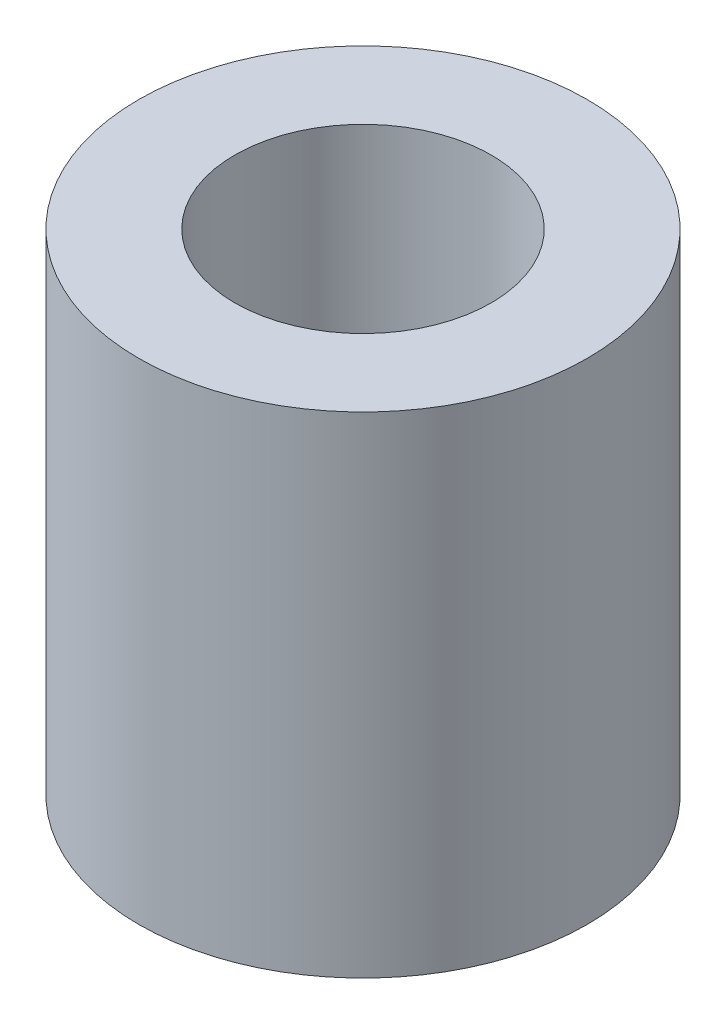
ISO-10303-21;
HEADER;
FILE_DESCRIPTION(('STEP AP214'),'2;1');
FILE_NAME('part.step','',(''),(''),'','','');
FILE_SCHEMA(('AUTOMOTIVE_DESIGN { 1 0 10303 214 1 1 1 1 }'));
ENDSEC;
DATA;
#1=APPLICATION_CONTEXT('core data for automotive mechanical design processes');
#2=APPLICATION_PROTOCOL_DEFINITION('international standard','automotive_design',2000,#1);
#3=PRODUCT_CONTEXT('',#1,'mechanical');
#4=PRODUCT('Part','Part','',(#3));
#5=PRODUCT_RELATED_PRODUCT_CATEGORY('part','',(#4));
#6=PRODUCT_DEFINITION_FORMATION('','',#4);
#7=PRODUCT_DEFINITION_CONTEXT('part definition',#1,'design');
#8=PRODUCT_DEFINITION('design','',#6,#7);
#9=PRODUCT_DEFINITION_SHAPE('','',#8);
#10=(LENGTH_UNIT() NAMED_UNIT(*) SI_UNIT(.MILLI.,.METRE.));
#11=(NAMED_UNIT(*) PLANE_ANGLE_UNIT() SI_UNIT($,.RADIAN.));
#12=(NAMED_UNIT(*) SI_UNIT($,.STERADIAN.) SOLID_ANGLE_UNIT());
#13=UNCERTAINTY_MEASURE_WITH_UNIT(LENGTH_MEASURE(1.E-05),#10,'distance_accuracy_value','');
#14=(GEOMETRIC_REPRESENTATION_CONTEXT(3) GLOBAL_UNCERTAINTY_ASSIGNED_CONTEXT((#13)) GLOBAL_UNIT_ASSIGNED_CONTEXT((#10,
#11,#12)) REPRESENTATION_CONTEXT('',''));
#15=CARTESIAN_POINT('',(0.,0.,0.));
#16=DIRECTION('',(0.,0.,1.));
#17=DIRECTION('',(1.,0.,0.));
#18=AXIS2_PLACEMENT_3D('',#15,#16,#17);
#19=CARTESIAN_POINT('',(0.,11.666,0.));
#20=DIRECTION('',(0.,1.,0.));
#21=DIRECTION('',(0.,0.,1.));
#22=AXIS2_PLACEMENT_3D('',#19,#20,#21);
#23=PLANE('',#22);
#24=CARTESIAN_POINT('',(0.,11.666,0.));
#25=DIRECTION('',(0.,1.,0.));
#26=DIRECTION('',(0.,0.,1.));
#27=AXIS2_PLACEMENT_3D('',#24,#25,#26);
#28=CIRCLE('',#27,5.335);
#29=CARTESIAN_POINT('',(0.,11.666,5.335));
#30=VERTEX_POINT('',#29);
#31=EDGE_CURVE('E10',#30,#30,#28,.T.);
#32=ORIENTED_EDGE('',*,*,#31,.T.);
#33=EDGE_LOOP('',(#32));
#34=FACE_BOUND('',#33,.T.);
#35=CARTESIAN_POINT('',(0.,11.666,0.));
#36=DIRECTION('',(0.,1.,0.));
#37=DIRECTION('',(0.,0.,1.));
#38=AXIS2_PLACEMENT_3D('',#35,#36,#37);
#39=CIRCLE('',#38,3.05);
#40=CARTESIAN_POINT('',(0.,11.666,3.05));
#41=VERTEX_POINT('',#40);
#42=EDGE_CURVE('E44',#41,#41,#39,.T.);
#43=ORIENTED_EDGE('',*,*,#42,.F.);
#44=EDGE_LOOP('',(#43));
#45=FACE_BOUND('',#44,.T.);
#46=ADVANCED_FACE('F33',(#34,#45),#23,.T.);
#47=CARTESIAN_POINT('',(0.,0.,0.));
#48=DIRECTION('',(0.,1.,0.));
#49=DIRECTION('',(0.,0.,1.));
#50=AXIS2_PLACEMENT_3D('',#47,#48,#49);
#51=PLANE('',#50);
#52=CARTESIAN_POINT('',(0.,0.,0.));
#53=DIRECTION('',(0.,1.,0.));
#54=DIRECTION('',(0.,0.,1.));
#55=AXIS2_PLACEMENT_3D('',#52,#53,#54);
#56=CIRCLE('',#55,5.335);
#57=CARTESIAN_POINT('',(0.,0.,5.335));
#58=VERTEX_POINT('',#57);
#59=EDGE_CURVE('E37',#58,#58,#56,.T.);
#60=ORIENTED_EDGE('',*,*,#59,.F.);
#61=EDGE_LOOP('',(#60));
#62=FACE_BOUND('',#61,.T.);
#63=CARTESIAN_POINT('',(0.,0.,0.));
#64=DIRECTION('',(0.,1.,0.));
#65=DIRECTION('',(0.,0.,1.));
#66=AXIS2_PLACEMENT_3D('',#63,#64,#65);
#67=CIRCLE('',#66,3.05);
#68=CARTESIAN_POINT('',(0.,0.,3.05));
#69=VERTEX_POINT('',#68);
#70=EDGE_CURVE('E46',#69,#69,#67,.T.);
#71=ORIENTED_EDGE('',*,*,#70,.T.);
#72=EDGE_LOOP('',(#71));
#73=FACE_BOUND('',#72,.T.);
#74=ADVANCED_FACE('F56',(#62,#73),#51,.F.);
#75=CARTESIAN_POINT('',(0.,11.666,0.));
#76=DIRECTION('',(0.,-1.,0.));
#77=DIRECTION('',(0.,0.,-1.));
#78=AXIS2_PLACEMENT_3D('',#75,#76,#77);
#79=CYLINDRICAL_SURFACE('',#78,5.335);
#80=ORIENTED_EDGE('',*,*,#31,.F.);
#81=EDGE_LOOP('',(#80));
#82=FACE_BOUND('',#81,.T.);
#83=ORIENTED_EDGE('',*,*,#59,.T.);
#84=EDGE_LOOP('',(#83));
#85=FACE_BOUND('',#84,.T.);
#86=ADVANCED_FACE('F35',(#82,#85),#79,.T.);
#87=CARTESIAN_POINT('',(0.,11.666,0.));
#88=DIRECTION('',(0.,-1.,0.));
#89=DIRECTION('',(0.,0.,-1.));
#90=AXIS2_PLACEMENT_3D('',#87,#88,#89);
#91=CYLINDRICAL_SURFACE('',#90,3.05);
#92=ORIENTED_EDGE('',*,*,#42,.T.);
#93=EDGE_LOOP('',(#92));
#94=FACE_BOUND('',#93,.T.);
#95=ORIENTED_EDGE('',*,*,#70,.F.);
#96=EDGE_LOOP('',(#95));
#97=FACE_BOUND('',#96,.T.);
#98=ADVANCED_FACE('F52',(#94,#97),#91,.F.);
#99=CLOSED_SHELL('',(#46,#74,#86,#98));
#100=MANIFOLD_SOLID_BREP('B2',#99);
#101=ADVANCED_BREP_SHAPE_REPRESENTATION('',(#18,#100),#14);
#102=SHAPE_DEFINITION_REPRESENTATION(#9,#101);
ENDSEC;
END-ISO-10303-21;
